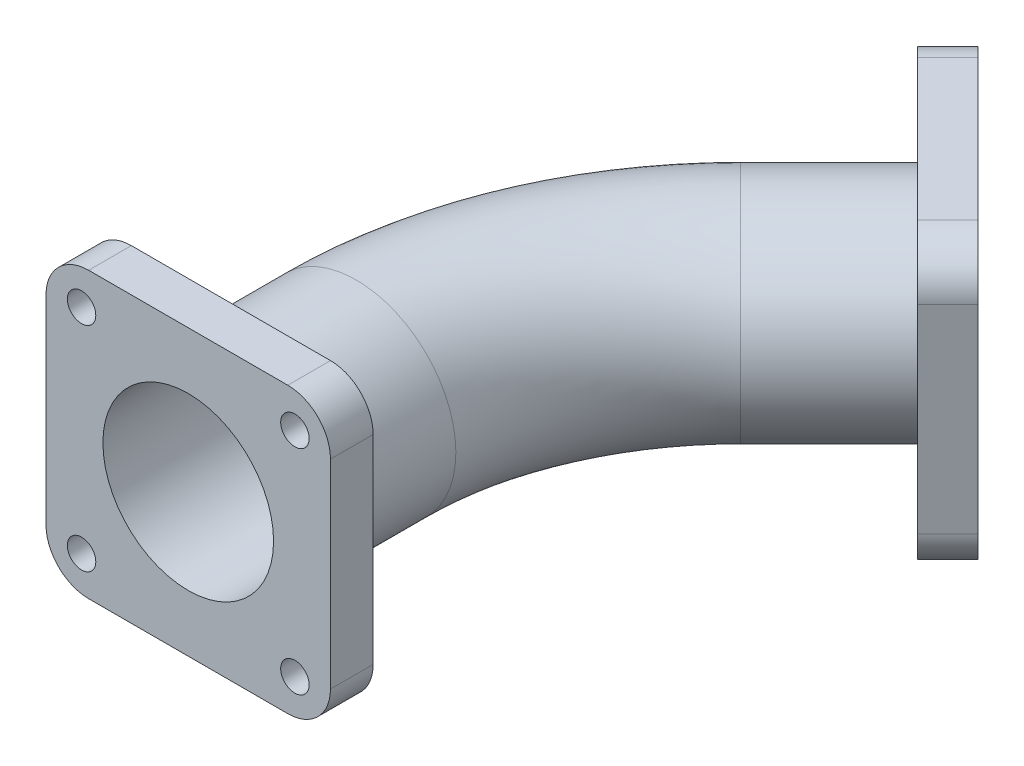
ISO-10303-21;
HEADER;
FILE_DESCRIPTION(('STEP AP214'),'2;1');
FILE_NAME('part.step','',(''),(''),'','','');
FILE_SCHEMA(('AUTOMOTIVE_DESIGN { 1 0 10303 214 1 1 1 1 }'));
ENDSEC;
DATA;
#1=APPLICATION_CONTEXT('core data for automotive mechanical design processes');
#2=APPLICATION_PROTOCOL_DEFINITION('international standard','automotive_design',2000,#1);
#3=PRODUCT_CONTEXT('',#1,'mechanical');
#4=PRODUCT('Part','Part','',(#3));
#5=PRODUCT_RELATED_PRODUCT_CATEGORY('part','',(#4));
#6=PRODUCT_DEFINITION_FORMATION('','',#4);
#7=PRODUCT_DEFINITION_CONTEXT('part definition',#1,'design');
#8=PRODUCT_DEFINITION('design','',#6,#7);
#9=PRODUCT_DEFINITION_SHAPE('','',#8);
#10=(LENGTH_UNIT() NAMED_UNIT(*) SI_UNIT(.MILLI.,.METRE.));
#11=(NAMED_UNIT(*) PLANE_ANGLE_UNIT() SI_UNIT($,.RADIAN.));
#12=(NAMED_UNIT(*) SI_UNIT($,.STERADIAN.) SOLID_ANGLE_UNIT());
#13=UNCERTAINTY_MEASURE_WITH_UNIT(LENGTH_MEASURE(1.E-05),#10,'distance_accuracy_value','');
#14=(GEOMETRIC_REPRESENTATION_CONTEXT(3) GLOBAL_UNCERTAINTY_ASSIGNED_CONTEXT((#13)) GLOBAL_UNIT_ASSIGNED_CONTEXT((#10,
#11,#12)) REPRESENTATION_CONTEXT('',''));
#15=CARTESIAN_POINT('',(0.,0.,0.));
#16=DIRECTION('',(0.,0.,1.));
#17=DIRECTION('',(1.,0.,0.));
#18=AXIS2_PLACEMENT_3D('',#15,#16,#17);
#19=CARTESIAN_POINT('',(0.,0.,0.));
#20=DIRECTION('',(0.,0.,-1.));
#21=DIRECTION('',(-1.,0.,0.));
#22=AXIS2_PLACEMENT_3D('',#19,#20,#21);
#23=PLANE('',#22);
#24=DIRECTION('',(-1.,0.,0.));
#25=VECTOR('',#24,1.);
#26=CARTESIAN_POINT('',(-50.,50.,0.));
#27=LINE('',#26,#25);
#28=CARTESIAN_POINT('',(35.,50.,0.));
#29=VERTEX_POINT('',#28);
#30=CARTESIAN_POINT('',(-35.,50.,0.));
#31=VERTEX_POINT('',#30);
#32=EDGE_CURVE('E173',#29,#31,#27,.T.);
#33=ORIENTED_EDGE('',*,*,#32,.F.);
#34=CARTESIAN_POINT('',(35.,35.,0.));
#35=DIRECTION('',(0.,0.,-1.));
#36=DIRECTION('',(-1.,0.,0.));
#37=AXIS2_PLACEMENT_3D('',#34,#35,#36);
#38=CIRCLE('',#37,15.);
#39=CARTESIAN_POINT('',(50.,35.,0.));
#40=VERTEX_POINT('',#39);
#41=EDGE_CURVE('E155',#29,#40,#38,.T.);
#42=ORIENTED_EDGE('',*,*,#41,.T.);
#43=DIRECTION('',(0.,1.,0.));
#44=VECTOR('',#43,1.);
#45=CARTESIAN_POINT('',(50.,-50.,0.));
#46=LINE('',#45,#44);
#47=CARTESIAN_POINT('',(50.,-35.,0.));
#48=VERTEX_POINT('',#47);
#49=EDGE_CURVE('E185',#48,#40,#46,.T.);
#50=ORIENTED_EDGE('',*,*,#49,.F.);
#51=CARTESIAN_POINT('',(35.,-35.,0.));
#52=DIRECTION('',(0.,0.,-1.));
#53=DIRECTION('',(-1.,0.,0.));
#54=AXIS2_PLACEMENT_3D('',#51,#52,#53);
#55=CIRCLE('',#54,15.);
#56=CARTESIAN_POINT('',(35.,-50.,0.));
#57=VERTEX_POINT('',#56);
#58=EDGE_CURVE('E178',#48,#57,#55,.T.);
#59=ORIENTED_EDGE('',*,*,#58,.T.);
#60=DIRECTION('',(1.,0.,0.));
#61=VECTOR('',#60,1.);
#62=CARTESIAN_POINT('',(-50.,-50.,0.));
#63=LINE('',#62,#61);
#64=CARTESIAN_POINT('',(-35.,-50.,0.));
#65=VERTEX_POINT('',#64);
#66=EDGE_CURVE('E190',#65,#57,#63,.T.);
#67=ORIENTED_EDGE('',*,*,#66,.F.);
#68=CARTESIAN_POINT('',(-35.,-35.,0.));
#69=DIRECTION('',(0.,0.,-1.));
#70=DIRECTION('',(-1.,0.,0.));
#71=AXIS2_PLACEMENT_3D('',#68,#69,#70);
#72=CIRCLE('',#71,15.);
#73=CARTESIAN_POINT('',(-50.,-35.,0.));
#74=VERTEX_POINT('',#73);
#75=EDGE_CURVE('E205',#65,#74,#72,.T.);
#76=ORIENTED_EDGE('',*,*,#75,.T.);
#77=DIRECTION('',(0.,-1.,0.));
#78=VECTOR('',#77,1.);
#79=CARTESIAN_POINT('',(-50.,-50.,0.));
#80=LINE('',#79,#78);
#81=CARTESIAN_POINT('',(-50.,35.,0.));
#82=VERTEX_POINT('',#81);
#83=EDGE_CURVE('E184',#82,#74,#80,.T.);
#84=ORIENTED_EDGE('',*,*,#83,.F.);
#85=CARTESIAN_POINT('',(-35.,35.,0.));
#86=DIRECTION('',(0.,0.,-1.));
#87=DIRECTION('',(-1.,0.,0.));
#88=AXIS2_PLACEMENT_3D('',#85,#86,#87);
#89=CIRCLE('',#88,15.);
#90=EDGE_CURVE('E167',#82,#31,#89,.T.);
#91=ORIENTED_EDGE('',*,*,#90,.T.);
#92=EDGE_LOOP('',(#33,#42,#50,#59,#67,#76,#84,#91));
#93=FACE_BOUND('',#92,.T.);
#94=CARTESIAN_POINT('',(-37.5,37.5,0.));
#95=DIRECTION('',(0.,0.,1.));
#96=DIRECTION('',(1.,0.,0.));
#97=AXIS2_PLACEMENT_3D('',#94,#95,#96);
#98=CIRCLE('',#97,5.);
#99=CARTESIAN_POINT('',(-32.5,37.5,0.));
#100=VERTEX_POINT('',#99);
#101=EDGE_CURVE('E350',#100,#100,#98,.T.);
#102=ORIENTED_EDGE('',*,*,#101,.T.);
#103=EDGE_LOOP('',(#102));
#104=FACE_BOUND('',#103,.T.);
#105=CARTESIAN_POINT('',(37.5,37.5,0.));
#106=DIRECTION('',(0.,0.,1.));
#107=DIRECTION('',(1.,0.,0.));
#108=AXIS2_PLACEMENT_3D('',#105,#106,#107);
#109=CIRCLE('',#108,5.);
#110=CARTESIAN_POINT('',(42.5,37.5,0.));
#111=VERTEX_POINT('',#110);
#112=EDGE_CURVE('E358',#111,#111,#109,.T.);
#113=ORIENTED_EDGE('',*,*,#112,.T.);
#114=EDGE_LOOP('',(#113));
#115=FACE_BOUND('',#114,.T.);
#116=CARTESIAN_POINT('',(37.5,-37.5,0.));
#117=DIRECTION('',(0.,0.,1.));
#118=DIRECTION('',(1.,0.,0.));
#119=AXIS2_PLACEMENT_3D('',#116,#117,#118);
#120=CIRCLE('',#119,5.);
#121=CARTESIAN_POINT('',(42.5,-37.5,0.));
#122=VERTEX_POINT('',#121);
#123=EDGE_CURVE('E366',#122,#122,#120,.T.);
#124=ORIENTED_EDGE('',*,*,#123,.T.);
#125=EDGE_LOOP('',(#124));
#126=FACE_BOUND('',#125,.T.);
#127=CARTESIAN_POINT('',(-37.5,-37.5,0.));
#128=DIRECTION('',(0.,0.,1.));
#129=DIRECTION('',(1.,0.,0.));
#130=AXIS2_PLACEMENT_3D('',#127,#128,#129);
#131=CIRCLE('',#130,5.);
#132=CARTESIAN_POINT('',(-32.5,-37.5,0.));
#133=VERTEX_POINT('',#132);
#134=EDGE_CURVE('E335',#133,#133,#131,.T.);
#135=ORIENTED_EDGE('',*,*,#134,.T.);
#136=EDGE_LOOP('',(#135));
#137=FACE_BOUND('',#136,.T.);
#138=CARTESIAN_POINT('',(0.,0.,0.));
#139=DIRECTION('',(0.,0.,1.));
#140=DIRECTION('',(1.,0.,0.));
#141=AXIS2_PLACEMENT_3D('',#138,#139,#140);
#142=CIRCLE('',#141,35.);
#143=CARTESIAN_POINT('',(35.,0.,0.));
#144=VERTEX_POINT('',#143);
#145=EDGE_CURVE('E331',#144,#144,#142,.T.);
#146=ORIENTED_EDGE('',*,*,#145,.T.);
#147=EDGE_LOOP('',(#146));
#148=FACE_BOUND('',#147,.T.);
#149=ADVANCED_FACE('F39',(#93,#104,#115,#126,#137,#148),#23,.T.);
#150=CARTESIAN_POINT('',(50.,-50.,15.));
#151=DIRECTION('',(-1.,0.,0.));
#152=DIRECTION('',(0.,0.,1.));
#153=AXIS2_PLACEMENT_3D('',#150,#151,#152);
#154=PLANE('',#153);
#155=ORIENTED_EDGE('',*,*,#49,.T.);
#156=DIRECTION('',(0.,0.,-1.));
#157=VECTOR('',#156,1.);
#158=CARTESIAN_POINT('',(50.,35.,15.));
#159=LINE('',#158,#157);
#160=CARTESIAN_POINT('',(50.,35.,15.));
#161=VERTEX_POINT('',#160);
#162=EDGE_CURVE('E160',#40,#161,#159,.F.);
#163=ORIENTED_EDGE('',*,*,#162,.T.);
#164=DIRECTION('',(0.,1.,0.));
#165=VECTOR('',#164,1.);
#166=CARTESIAN_POINT('',(50.,-50.,15.));
#167=LINE('',#166,#165);
#168=CARTESIAN_POINT('',(50.,-35.,15.));
#169=VERTEX_POINT('',#168);
#170=EDGE_CURVE('E199',#169,#161,#167,.T.);
#171=ORIENTED_EDGE('',*,*,#170,.F.);
#172=DIRECTION('',(0.,0.,-1.));
#173=VECTOR('',#172,1.);
#174=CARTESIAN_POINT('',(50.,-35.,15.));
#175=LINE('',#174,#173);
#176=EDGE_CURVE('E166',#169,#48,#175,.T.);
#177=ORIENTED_EDGE('',*,*,#176,.T.);
#178=EDGE_LOOP('',(#155,#163,#171,#177));
#179=FACE_BOUND('',#178,.T.);
#180=ADVANCED_FACE('F403',(#179),#154,.F.);
#181=CARTESIAN_POINT('',(-50.,50.,15.));
#182=DIRECTION('',(0.,-1.,0.));
#183=DIRECTION('',(0.,0.,-1.));
#184=AXIS2_PLACEMENT_3D('',#181,#182,#183);
#185=PLANE('',#184);
#186=DIRECTION('',(-1.,0.,0.));
#187=VECTOR('',#186,1.);
#188=CARTESIAN_POINT('',(-50.,50.,15.));
#189=LINE('',#188,#187);
#190=CARTESIAN_POINT('',(35.,50.,15.));
#191=VERTEX_POINT('',#190);
#192=CARTESIAN_POINT('',(-35.,50.,15.));
#193=VERTEX_POINT('',#192);
#194=EDGE_CURVE('E176',#191,#193,#189,.T.);
#195=ORIENTED_EDGE('',*,*,#194,.F.);
#196=DIRECTION('',(0.,0.,-1.));
#197=VECTOR('',#196,1.);
#198=CARTESIAN_POINT('',(35.,50.,15.));
#199=LINE('',#198,#197);
#200=EDGE_CURVE('E159',#191,#29,#199,.T.);
#201=ORIENTED_EDGE('',*,*,#200,.T.);
#202=ORIENTED_EDGE('',*,*,#32,.T.);
#203=DIRECTION('',(0.,0.,-1.));
#204=VECTOR('',#203,1.);
#205=CARTESIAN_POINT('',(-35.,50.,15.));
#206=LINE('',#205,#204);
#207=EDGE_CURVE('E179',#31,#193,#206,.F.);
#208=ORIENTED_EDGE('',*,*,#207,.T.);
#209=EDGE_LOOP('',(#195,#201,#202,#208));
#210=FACE_BOUND('',#209,.T.);
#211=ADVANCED_FACE('F172',(#210),#185,.F.);
#212=CARTESIAN_POINT('',(-50.,-50.,15.));
#213=DIRECTION('',(1.,0.,0.));
#214=DIRECTION('',(0.,0.,-1.));
#215=AXIS2_PLACEMENT_3D('',#212,#213,#214);
#216=PLANE('',#215);
#217=DIRECTION('',(0.,-1.,0.));
#218=VECTOR('',#217,1.);
#219=CARTESIAN_POINT('',(-50.,-50.,15.));
#220=LINE('',#219,#218);
#221=CARTESIAN_POINT('',(-50.,35.,15.));
#222=VERTEX_POINT('',#221);
#223=CARTESIAN_POINT('',(-50.,-35.,15.));
#224=VERTEX_POINT('',#223);
#225=EDGE_CURVE('E385',#222,#224,#220,.T.);
#226=ORIENTED_EDGE('',*,*,#225,.F.);
#227=DIRECTION('',(0.,0.,-1.));
#228=VECTOR('',#227,1.);
#229=CARTESIAN_POINT('',(-50.,35.,15.));
#230=LINE('',#229,#228);
#231=EDGE_CURVE('E230',#222,#82,#230,.T.);
#232=ORIENTED_EDGE('',*,*,#231,.T.);
#233=ORIENTED_EDGE('',*,*,#83,.T.);
#234=DIRECTION('',(0.,0.,-1.));
#235=VECTOR('',#234,1.);
#236=CARTESIAN_POINT('',(-50.,-35.,15.));
#237=LINE('',#236,#235);
#238=EDGE_CURVE('E227',#74,#224,#237,.F.);
#239=ORIENTED_EDGE('',*,*,#238,.T.);
#240=EDGE_LOOP('',(#226,#232,#233,#239));
#241=FACE_BOUND('',#240,.T.);
#242=ADVANCED_FACE('F411',(#241),#216,.F.);
#243=CARTESIAN_POINT('',(-50.,-50.,15.));
#244=DIRECTION('',(0.,1.,0.));
#245=DIRECTION('',(0.,0.,1.));
#246=AXIS2_PLACEMENT_3D('',#243,#244,#245);
#247=PLANE('',#246);
#248=DIRECTION('',(1.,0.,0.));
#249=VECTOR('',#248,1.);
#250=CARTESIAN_POINT('',(-50.,-50.,15.));
#251=LINE('',#250,#249);
#252=CARTESIAN_POINT('',(-35.,-50.,15.));
#253=VERTEX_POINT('',#252);
#254=CARTESIAN_POINT('',(35.,-50.,15.));
#255=VERTEX_POINT('',#254);
#256=EDGE_CURVE('E201',#253,#255,#251,.T.);
#257=ORIENTED_EDGE('',*,*,#256,.F.);
#258=DIRECTION('',(0.,0.,-1.));
#259=VECTOR('',#258,1.);
#260=CARTESIAN_POINT('',(-35.,-50.,15.));
#261=LINE('',#260,#259);
#262=EDGE_CURVE('E237',#253,#65,#261,.T.);
#263=ORIENTED_EDGE('',*,*,#262,.T.);
#264=ORIENTED_EDGE('',*,*,#66,.T.);
#265=DIRECTION('',(0.,0.,-1.));
#266=VECTOR('',#265,1.);
#267=CARTESIAN_POINT('',(35.,-50.,15.));
#268=LINE('',#267,#266);
#269=EDGE_CURVE('E234',#57,#255,#268,.F.);
#270=ORIENTED_EDGE('',*,*,#269,.T.);
#271=EDGE_LOOP('',(#257,#263,#264,#270));
#272=FACE_BOUND('',#271,.T.);
#273=ADVANCED_FACE('F405',(#272),#247,.F.);
#274=CARTESIAN_POINT('',(0.,0.,15.));
#275=DIRECTION('',(0.,0.,-1.));
#276=DIRECTION('',(-1.,0.,0.));
#277=AXIS2_PLACEMENT_3D('',#274,#275,#276);
#278=PLANE('',#277);
#279=CARTESIAN_POINT('',(-37.5,-37.5,15.));
#280=DIRECTION('',(0.,0.,1.));
#281=DIRECTION('',(1.,0.,0.));
#282=AXIS2_PLACEMENT_3D('',#279,#280,#281);
#283=CIRCLE('',#282,5.);
#284=CARTESIAN_POINT('',(-32.5,-37.5,15.));
#285=VERTEX_POINT('',#284);
#286=EDGE_CURVE('E370',#285,#285,#283,.T.);
#287=ORIENTED_EDGE('',*,*,#286,.F.);
#288=EDGE_LOOP('',(#287));
#289=FACE_BOUND('',#288,.T.);
#290=CARTESIAN_POINT('',(37.5,-37.5,15.));
#291=DIRECTION('',(0.,0.,1.));
#292=DIRECTION('',(1.,0.,0.));
#293=AXIS2_PLACEMENT_3D('',#290,#291,#292);
#294=CIRCLE('',#293,5.);
#295=CARTESIAN_POINT('',(42.5,-37.5,15.));
#296=VERTEX_POINT('',#295);
#297=EDGE_CURVE('E362',#296,#296,#294,.T.);
#298=ORIENTED_EDGE('',*,*,#297,.F.);
#299=EDGE_LOOP('',(#298));
#300=FACE_BOUND('',#299,.T.);
#301=CARTESIAN_POINT('',(37.5,37.5,15.));
#302=DIRECTION('',(0.,0.,1.));
#303=DIRECTION('',(1.,0.,0.));
#304=AXIS2_PLACEMENT_3D('',#301,#302,#303);
#305=CIRCLE('',#304,5.);
#306=CARTESIAN_POINT('',(42.5,37.5,15.));
#307=VERTEX_POINT('',#306);
#308=EDGE_CURVE('E354',#307,#307,#305,.T.);
#309=ORIENTED_EDGE('',*,*,#308,.F.);
#310=EDGE_LOOP('',(#309));
#311=FACE_BOUND('',#310,.T.);
#312=CARTESIAN_POINT('',(-37.5,37.5,15.));
#313=DIRECTION('',(0.,0.,1.));
#314=DIRECTION('',(1.,0.,0.));
#315=AXIS2_PLACEMENT_3D('',#312,#313,#314);
#316=CIRCLE('',#315,5.);
#317=CARTESIAN_POINT('',(-32.5,37.5,15.));
#318=VERTEX_POINT('',#317);
#319=EDGE_CURVE('E346',#318,#318,#316,.T.);
#320=ORIENTED_EDGE('',*,*,#319,.F.);
#321=EDGE_LOOP('',(#320));
#322=FACE_BOUND('',#321,.T.);
#323=CARTESIAN_POINT('',(0.,0.,15.));
#324=DIRECTION('',(0.,0.,1.));
#325=DIRECTION('',(1.,0.,0.));
#326=AXIS2_PLACEMENT_3D('',#323,#324,#325);
#327=CIRCLE('',#326,30.);
#328=CARTESIAN_POINT('',(30.,0.,15.));
#329=VERTEX_POINT('',#328);
#330=EDGE_CURVE('E192',#329,#329,#327,.T.);
#331=ORIENTED_EDGE('',*,*,#330,.F.);
#332=EDGE_LOOP('',(#331));
#333=FACE_BOUND('',#332,.T.);
#334=ORIENTED_EDGE('',*,*,#170,.T.);
#335=CARTESIAN_POINT('',(35.,35.,15.));
#336=DIRECTION('',(0.,0.,-1.));
#337=DIRECTION('',(-1.,0.,0.));
#338=AXIS2_PLACEMENT_3D('',#335,#336,#337);
#339=CIRCLE('',#338,15.);
#340=EDGE_CURVE('E224',#161,#191,#339,.F.);
#341=ORIENTED_EDGE('',*,*,#340,.T.);
#342=ORIENTED_EDGE('',*,*,#194,.T.);
#343=CARTESIAN_POINT('',(-35.,35.,15.));
#344=DIRECTION('',(0.,0.,-1.));
#345=DIRECTION('',(-1.,0.,0.));
#346=AXIS2_PLACEMENT_3D('',#343,#344,#345);
#347=CIRCLE('',#346,15.);
#348=EDGE_CURVE('E221',#193,#222,#347,.F.);
#349=ORIENTED_EDGE('',*,*,#348,.T.);
#350=ORIENTED_EDGE('',*,*,#225,.T.);
#351=CARTESIAN_POINT('',(-35.,-35.,15.));
#352=DIRECTION('',(0.,0.,-1.));
#353=DIRECTION('',(-1.,0.,0.));
#354=AXIS2_PLACEMENT_3D('',#351,#352,#353);
#355=CIRCLE('',#354,15.);
#356=EDGE_CURVE('E218',#224,#253,#355,.F.);
#357=ORIENTED_EDGE('',*,*,#356,.T.);
#358=ORIENTED_EDGE('',*,*,#256,.T.);
#359=CARTESIAN_POINT('',(35.,-35.,15.));
#360=DIRECTION('',(0.,0.,-1.));
#361=DIRECTION('',(-1.,0.,0.));
#362=AXIS2_PLACEMENT_3D('',#359,#360,#361);
#363=CIRCLE('',#362,15.);
#364=EDGE_CURVE('E215',#255,#169,#363,.F.);
#365=ORIENTED_EDGE('',*,*,#364,.T.);
#366=EDGE_LOOP('',(#334,#341,#342,#349,#350,#357,#358,#365));
#367=FACE_BOUND('',#366,.T.);
#368=ADVANCED_FACE('F393',(#289,#300,#311,#322,#333,#367),#278,.F.);
#369=CARTESIAN_POINT('',(0.,0.,15.));
#370=DIRECTION('',(0.,0.,-1.));
#371=DIRECTION('',(-1.,0.,0.));
#372=AXIS2_PLACEMENT_3D('',#369,#370,#371);
#373=CYLINDRICAL_SURFACE('',#372,30.);
#374=ORIENTED_EDGE('',*,*,#330,.T.);
#375=EDGE_LOOP('',(#374));
#376=FACE_BOUND('',#375,.T.);
#377=CARTESIAN_POINT('',(0.,0.,-44.0811690796315));
#378=DIRECTION('',(0.,0.,1.));
#379=DIRECTION('',(1.,0.,0.));
#380=AXIS2_PLACEMENT_3D('',#377,#378,#379);
#381=CIRCLE('',#380,30.);
#382=CARTESIAN_POINT('',(-30.,0.,-44.0811690796313));
#383=VERTEX_POINT('',#382);
#384=EDGE_CURVE('E326',#383,#383,#381,.F.);
#385=ORIENTED_EDGE('',*,*,#384,.T.);
#386=EDGE_LOOP('',(#385));
#387=FACE_BOUND('',#386,.T.);
#388=ADVANCED_FACE('F457',(#376,#387),#373,.F.);
#389=CARTESIAN_POINT('',(-37.5,37.5,15.));
#390=DIRECTION('',(0.,0.,-1.));
#391=DIRECTION('',(-1.,0.,0.));
#392=AXIS2_PLACEMENT_3D('',#389,#390,#391);
#393=CYLINDRICAL_SURFACE('',#392,5.);
#394=ORIENTED_EDGE('',*,*,#319,.T.);
#395=EDGE_LOOP('',(#394));
#396=FACE_BOUND('',#395,.T.);
#397=ORIENTED_EDGE('',*,*,#101,.F.);
#398=EDGE_LOOP('',(#397));
#399=FACE_BOUND('',#398,.T.);
#400=ADVANCED_FACE('F465',(#396,#399),#393,.F.);
#401=CARTESIAN_POINT('',(37.5,37.5,15.));
#402=DIRECTION('',(0.,0.,-1.));
#403=DIRECTION('',(-1.,0.,0.));
#404=AXIS2_PLACEMENT_3D('',#401,#402,#403);
#405=CYLINDRICAL_SURFACE('',#404,5.);
#406=ORIENTED_EDGE('',*,*,#308,.T.);
#407=EDGE_LOOP('',(#406));
#408=FACE_BOUND('',#407,.T.);
#409=ORIENTED_EDGE('',*,*,#112,.F.);
#410=EDGE_LOOP('',(#409));
#411=FACE_BOUND('',#410,.T.);
#412=ADVANCED_FACE('F474',(#408,#411),#405,.F.);
#413=CARTESIAN_POINT('',(37.5,-37.5,15.));
#414=DIRECTION('',(0.,0.,-1.));
#415=DIRECTION('',(-1.,0.,0.));
#416=AXIS2_PLACEMENT_3D('',#413,#414,#415);
#417=CYLINDRICAL_SURFACE('',#416,5.);
#418=ORIENTED_EDGE('',*,*,#297,.T.);
#419=EDGE_LOOP('',(#418));
#420=FACE_BOUND('',#419,.T.);
#421=ORIENTED_EDGE('',*,*,#123,.F.);
#422=EDGE_LOOP('',(#421));
#423=FACE_BOUND('',#422,.T.);
#424=ADVANCED_FACE('F482',(#420,#423),#417,.F.);
#425=CARTESIAN_POINT('',(-37.5,-37.5,15.));
#426=DIRECTION('',(0.,0.,-1.));
#427=DIRECTION('',(-1.,0.,0.));
#428=AXIS2_PLACEMENT_3D('',#425,#426,#427);
#429=CYLINDRICAL_SURFACE('',#428,5.);
#430=ORIENTED_EDGE('',*,*,#286,.T.);
#431=EDGE_LOOP('',(#430));
#432=FACE_BOUND('',#431,.T.);
#433=ORIENTED_EDGE('',*,*,#134,.F.);
#434=EDGE_LOOP('',(#433));
#435=FACE_BOUND('',#434,.T.);
#436=ADVANCED_FACE('F490',(#432,#435),#429,.F.);
#437=CARTESIAN_POINT('',(0.,0.,0.));
#438=DIRECTION('',(0.,0.,-1.));
#439=DIRECTION('',(-1.,0.,0.));
#440=AXIS2_PLACEMENT_3D('',#437,#438,#439);
#441=CYLINDRICAL_SURFACE('',#440,35.);
#442=CARTESIAN_POINT('',(0.,0.,-44.0811690796315));
#443=DIRECTION('',(0.,0.,1.));
#444=DIRECTION('',(1.,0.,0.));
#445=AXIS2_PLACEMENT_3D('',#442,#443,#444);
#446=CIRCLE('',#445,35.);
#447=CARTESIAN_POINT('',(-35.,0.,-44.0811690796313));
#448=VERTEX_POINT('',#447);
#449=EDGE_CURVE('E325',#448,#448,#446,.T.);
#450=ORIENTED_EDGE('',*,*,#449,.T.);
#451=EDGE_LOOP('',(#450));
#452=FACE_BOUND('',#451,.T.);
#453=ORIENTED_EDGE('',*,*,#145,.F.);
#454=EDGE_LOOP('',(#453));
#455=FACE_BOUND('',#454,.T.);
#456=ADVANCED_FACE('F497',(#452,#455),#441,.T.);
#457=CARTESIAN_POINT('',(135.,0.,-44.081169079632));
#458=DIRECTION('',(0.,-1.,0.));
#459=DIRECTION('',(0.,0.,-1.));
#460=AXIS2_PLACEMENT_3D('',#457,#458,#459);
#461=TOROIDAL_SURFACE('',#460,135.,35.);
#462=CARTESIAN_POINT('',(39.5405845398167,0.,-139.540584539816));
#463=DIRECTION('',(-0.707106781186552,0.,0.707106781186543));
#464=DIRECTION('',(0.707106781186543,0.,0.707106781186552));
#465=AXIS2_PLACEMENT_3D('',#462,#463,#464);
#466=CIRCLE('',#465,35.);
#467=CARTESIAN_POINT('',(14.7918471982876,0.,-164.289321881346));
#468=VERTEX_POINT('',#467);
#469=EDGE_CURVE('E339',#468,#468,#466,.T.);
#470=CARTESIAN_POINT('',(135.,0.,-44.081169079632));
#471=DIRECTION('',(0.,-1.,0.));
#472=DIRECTION('',(0.,0.,-1.));
#473=AXIS2_PLACEMENT_3D('',#470,#471,#472);
#474=CIRCLE('',#473,170.);
#475=EDGE_CURVE('',#448,#468,#474,.T.);
#476=ORIENTED_EDGE('',*,*,#449,.F.);
#477=ORIENTED_EDGE('',*,*,#469,.T.);
#478=ORIENTED_EDGE('',*,*,#475,.T.);
#479=ORIENTED_EDGE('',*,*,#475,.F.);
#480=EDGE_LOOP('',(#476,#478,#477,#479));
#481=FACE_BOUND('',#480,.T.);
#482=ADVANCED_FACE('F505',(#481),#461,.T.);
#483=CARTESIAN_POINT('',(39.5405845398167,0.,-139.540584539817));
#484=DIRECTION('',(0.707106781186549,0.,-0.707106781186546));
#485=DIRECTION('',(-0.707106781186546,0.,-0.707106781186549));
#486=AXIS2_PLACEMENT_3D('',#483,#484,#485);
#487=CYLINDRICAL_SURFACE('',#486,35.);
#488=CARTESIAN_POINT('',(70.7106781186549,0.,-170.710678118655));
#489=DIRECTION('',(0.707106781186549,0.,-0.707106781186546));
#490=DIRECTION('',(-0.707106781186546,0.,-0.707106781186549));
#491=AXIS2_PLACEMENT_3D('',#488,#489,#490);
#492=CIRCLE('',#491,35.);
#493=CARTESIAN_POINT('',(45.9619407771258,0.,-195.459415460184));
#494=VERTEX_POINT('',#493);
#495=EDGE_CURVE('E321',#494,#494,#492,.T.);
#496=ORIENTED_EDGE('',*,*,#495,.F.);
#497=EDGE_LOOP('',(#496));
#498=FACE_BOUND('',#497,.T.);
#499=ORIENTED_EDGE('',*,*,#469,.F.);
#500=EDGE_LOOP('',(#499));
#501=FACE_BOUND('',#500,.T.);
#502=ADVANCED_FACE('F513',(#498,#501),#487,.T.);
#503=CARTESIAN_POINT('',(135.,0.,-44.081169079632));
#504=DIRECTION('',(0.,-1.,0.));
#505=DIRECTION('',(0.,0.,-1.));
#506=AXIS2_PLACEMENT_3D('',#503,#504,#505);
#507=TOROIDAL_SURFACE('',#506,135.,30.);
#508=CARTESIAN_POINT('',(39.5405845398167,0.,-139.540584539816));
#509=DIRECTION('',(-0.707106781186552,0.,0.707106781186543));
#510=DIRECTION('',(0.707106781186543,0.,0.707106781186552));
#511=AXIS2_PLACEMENT_3D('',#508,#509,#510);
#512=CIRCLE('',#511,30.);
#513=CARTESIAN_POINT('',(18.3273811042203,0.,-160.753787975413));
#514=VERTEX_POINT('',#513);
#515=EDGE_CURVE('E330',#514,#514,#512,.F.);
#516=CARTESIAN_POINT('',(135.,0.,-44.081169079632));
#517=DIRECTION('',(0.,-1.,0.));
#518=DIRECTION('',(0.,0.,-1.));
#519=AXIS2_PLACEMENT_3D('',#516,#517,#518);
#520=CIRCLE('',#519,165.);
#521=EDGE_CURVE('',#383,#514,#520,.T.);
#522=ORIENTED_EDGE('',*,*,#384,.F.);
#523=ORIENTED_EDGE('',*,*,#515,.T.);
#524=ORIENTED_EDGE('',*,*,#521,.T.);
#525=ORIENTED_EDGE('',*,*,#521,.F.);
#526=EDGE_LOOP('',(#522,#524,#523,#525));
#527=FACE_BOUND('',#526,.T.);
#528=ADVANCED_FACE('F522',(#527),#507,.F.);
#529=CARTESIAN_POINT('',(39.5405845398167,0.,-139.540584539817));
#530=DIRECTION('',(0.707106781186549,0.,-0.707106781186546));
#531=DIRECTION('',(-0.707106781186546,0.,-0.707106781186549));
#532=AXIS2_PLACEMENT_3D('',#529,#530,#531);
#533=CYLINDRICAL_SURFACE('',#532,30.);
#534=ORIENTED_EDGE('',*,*,#515,.F.);
#535=EDGE_LOOP('',(#534));
#536=FACE_BOUND('',#535,.T.);
#537=CARTESIAN_POINT('',(81.3172798364531,0.,-181.317279836453));
#538=DIRECTION('',(0.707106781186549,0.,-0.707106781186546));
#539=DIRECTION('',(-0.707106781186546,0.,-0.707106781186549));
#540=AXIS2_PLACEMENT_3D('',#537,#538,#539);
#541=CIRCLE('',#540,30.);
#542=CARTESIAN_POINT('',(60.1040764008567,0.,-202.530483272049));
#543=VERTEX_POINT('',#542);
#544=EDGE_CURVE('E679',#543,#543,#541,.T.);
#545=ORIENTED_EDGE('',*,*,#544,.T.);
#546=EDGE_LOOP('',(#545));
#547=FACE_BOUND('',#546,.T.);
#548=ADVANCED_FACE('F500',(#536,#547),#533,.F.);
#549=CARTESIAN_POINT('',(120.710678118655,0.,-120.710678118654));
#550=DIRECTION('',(0.707106781186549,0.,-0.707106781186546));
#551=DIRECTION('',(-0.707106781186546,0.,-0.707106781186549));
#552=AXIS2_PLACEMENT_3D('',#549,#550,#551);
#553=PLANE('',#552);
#554=CARTESIAN_POINT('',(97.2271824131504,37.5,-144.194173824159));
#555=DIRECTION('',(0.707106781186549,0.,-0.707106781186546));
#556=DIRECTION('',(-0.707106781186546,0.,-0.707106781186549));
#557=AXIS2_PLACEMENT_3D('',#554,#555,#556);
#558=CIRCLE('',#557,4.99999999999999);
#559=CARTESIAN_POINT('',(93.6916485072177,37.5,-147.729707730092));
#560=VERTEX_POINT('',#559);
#561=EDGE_CURVE('E690',#560,#560,#558,.T.);
#562=ORIENTED_EDGE('',*,*,#561,.T.);
#563=EDGE_LOOP('',(#562));
#564=FACE_BOUND('',#563,.T.);
#565=CARTESIAN_POINT('',(97.2271824131504,-37.5,-144.194173824159));
#566=DIRECTION('',(0.707106781186549,0.,-0.707106781186546));
#567=DIRECTION('',(-0.707106781186546,0.,-0.707106781186549));
#568=AXIS2_PLACEMENT_3D('',#565,#566,#567);
#569=CIRCLE('',#568,5.);
#570=CARTESIAN_POINT('',(93.6916485072176,-37.5,-147.729707730092));
#571=VERTEX_POINT('',#570);
#572=EDGE_CURVE('E698',#571,#571,#569,.T.);
#573=ORIENTED_EDGE('',*,*,#572,.T.);
#574=EDGE_LOOP('',(#573));
#575=FACE_BOUND('',#574,.T.);
#576=CARTESIAN_POINT('',(44.1941738241594,-37.5,-197.22718241315));
#577=DIRECTION('',(0.707106781186549,0.,-0.707106781186546));
#578=DIRECTION('',(-0.707106781186546,0.,-0.707106781186549));
#579=AXIS2_PLACEMENT_3D('',#576,#577,#578);
#580=CIRCLE('',#579,5.00000000000001);
#581=CARTESIAN_POINT('',(40.6586399182267,-37.5,-200.762716319083));
#582=VERTEX_POINT('',#581);
#583=EDGE_CURVE('E706',#582,#582,#580,.T.);
#584=ORIENTED_EDGE('',*,*,#583,.T.);
#585=EDGE_LOOP('',(#584));
#586=FACE_BOUND('',#585,.T.);
#587=CARTESIAN_POINT('',(44.1941738241594,37.5,-197.22718241315));
#588=DIRECTION('',(0.707106781186549,0.,-0.707106781186546));
#589=DIRECTION('',(-0.707106781186546,0.,-0.707106781186549));
#590=AXIS2_PLACEMENT_3D('',#587,#588,#589);
#591=CIRCLE('',#590,5.00000000000001);
#592=CARTESIAN_POINT('',(40.6586399182267,37.5,-200.762716319083));
#593=VERTEX_POINT('',#592);
#594=EDGE_CURVE('E714',#593,#593,#591,.T.);
#595=ORIENTED_EDGE('',*,*,#594,.T.);
#596=EDGE_LOOP('',(#595));
#597=FACE_BOUND('',#596,.T.);
#598=DIRECTION('',(0.707106781186546,0.,0.707106781186549));
#599=VECTOR('',#598,1.);
#600=CARTESIAN_POINT('',(106.066017177982,50.,-135.355339059327));
#601=LINE('',#600,#599);
#602=CARTESIAN_POINT('',(45.9619407771258,50.,-195.459415460184));
#603=VERTEX_POINT('',#602);
#604=CARTESIAN_POINT('',(95.459415460184,50.,-145.961940777125));
#605=VERTEX_POINT('',#604);
#606=EDGE_CURVE('E317',#603,#605,#601,.T.);
#607=ORIENTED_EDGE('',*,*,#606,.F.);
#608=CARTESIAN_POINT('',(45.9619407771258,35.,-195.459415460184));
#609=DIRECTION('',(0.707106781186549,0.,-0.707106781186546));
#610=DIRECTION('',(-0.707106781186546,0.,-0.707106781186549));
#611=AXIS2_PLACEMENT_3D('',#608,#609,#610);
#612=CIRCLE('',#611,15.);
#613=CARTESIAN_POINT('',(35.3553390593276,35.,-206.066017177982));
#614=VERTEX_POINT('',#613);
#615=EDGE_CURVE('E257',#603,#614,#612,.F.);
#616=ORIENTED_EDGE('',*,*,#615,.T.);
#617=DIRECTION('',(0.,1.,0.));
#618=VECTOR('',#617,1.);
#619=CARTESIAN_POINT('',(35.3553390593276,50.,-206.066017177982));
#620=LINE('',#619,#618);
#621=CARTESIAN_POINT('',(35.3553390593276,-35.,-206.066017177982));
#622=VERTEX_POINT('',#621);
#623=EDGE_CURVE('E676',#622,#614,#620,.T.);
#624=ORIENTED_EDGE('',*,*,#623,.F.);
#625=CARTESIAN_POINT('',(45.9619407771258,-35.,-195.459415460184));
#626=DIRECTION('',(0.707106781186549,0.,-0.707106781186546));
#627=DIRECTION('',(-0.707106781186546,0.,-0.707106781186549));
#628=AXIS2_PLACEMENT_3D('',#625,#626,#627);
#629=CIRCLE('',#628,15.);
#630=CARTESIAN_POINT('',(45.9619407771258,-50.,-195.459415460184));
#631=VERTEX_POINT('',#630);
#632=EDGE_CURVE('E254',#622,#631,#629,.F.);
#633=ORIENTED_EDGE('',*,*,#632,.T.);
#634=DIRECTION('',(-0.707106781186546,0.,-0.707106781186549));
#635=VECTOR('',#634,1.);
#636=CARTESIAN_POINT('',(106.066017177982,-50.,-135.355339059327));
#637=LINE('',#636,#635);
#638=CARTESIAN_POINT('',(95.459415460184,-50.,-145.961940777125));
#639=VERTEX_POINT('',#638);
#640=EDGE_CURVE('E305',#639,#631,#637,.T.);
#641=ORIENTED_EDGE('',*,*,#640,.F.);
#642=CARTESIAN_POINT('',(95.459415460184,-35.,-145.961940777125));
#643=DIRECTION('',(0.707106781186549,0.,-0.707106781186546));
#644=DIRECTION('',(-0.707106781186546,0.,-0.707106781186549));
#645=AXIS2_PLACEMENT_3D('',#642,#643,#644);
#646=CIRCLE('',#645,15.);
#647=CARTESIAN_POINT('',(106.066017177982,-35.,-135.355339059327));
#648=VERTEX_POINT('',#647);
#649=EDGE_CURVE('E248',#639,#648,#646,.F.);
#650=ORIENTED_EDGE('',*,*,#649,.T.);
#651=DIRECTION('',(0.,-1.,0.));
#652=VECTOR('',#651,1.);
#653=CARTESIAN_POINT('',(106.066017177982,50.,-135.355339059327));
#654=LINE('',#653,#652);
#655=CARTESIAN_POINT('',(106.066017177982,35.,-135.355339059327));
#656=VERTEX_POINT('',#655);
#657=EDGE_CURVE('E292',#656,#648,#654,.T.);
#658=ORIENTED_EDGE('',*,*,#657,.F.);
#659=CARTESIAN_POINT('',(95.459415460184,35.,-145.961940777125));
#660=DIRECTION('',(0.707106781186549,0.,-0.707106781186546));
#661=DIRECTION('',(-0.707106781186546,0.,-0.707106781186549));
#662=AXIS2_PLACEMENT_3D('',#659,#660,#661);
#663=CIRCLE('',#662,15.);
#664=EDGE_CURVE('E251',#656,#605,#663,.F.);
#665=ORIENTED_EDGE('',*,*,#664,.T.);
#666=EDGE_LOOP('',(#607,#616,#624,#633,#641,#650,#658,#665));
#667=FACE_BOUND('',#666,.T.);
#668=ORIENTED_EDGE('',*,*,#495,.T.);
#669=EDGE_LOOP('',(#668));
#670=FACE_BOUND('',#669,.T.);
#671=ADVANCED_FACE('F308',(#564,#575,#586,#597,#667,#670),#553,.F.);
#672=CARTESIAN_POINT('',(45.9619407771258,50.,-216.67261889578));
#673=DIRECTION('',(0.707106781186546,0.,0.707106781186549));
#674=DIRECTION('',(0.707106781186549,0.,-0.707106781186546));
#675=AXIS2_PLACEMENT_3D('',#672,#673,#674);
#676=PLANE('',#675);
#677=ORIENTED_EDGE('',*,*,#623,.T.);
#678=DIRECTION('',(-0.707106781186549,0.,0.707106781186546));
#679=VECTOR('',#678,1.);
#680=CARTESIAN_POINT('',(45.9619407771258,35.,-216.67261889578));
#681=LINE('',#680,#679);
#682=CARTESIAN_POINT('',(45.9619407771258,35.,-216.67261889578));
#683=VERTEX_POINT('',#682);
#684=EDGE_CURVE('E264',#614,#683,#681,.F.);
#685=ORIENTED_EDGE('',*,*,#684,.T.);
#686=DIRECTION('',(0.,1.,0.));
#687=VECTOR('',#686,1.);
#688=CARTESIAN_POINT('',(45.9619407771258,50.,-216.67261889578));
#689=LINE('',#688,#687);
#690=CARTESIAN_POINT('',(45.9619407771258,-35.,-216.67261889578));
#691=VERTEX_POINT('',#690);
#692=EDGE_CURVE('E312',#691,#683,#689,.T.);
#693=ORIENTED_EDGE('',*,*,#692,.F.);
#694=DIRECTION('',(-0.707106781186549,0.,0.707106781186546));
#695=VECTOR('',#694,1.);
#696=CARTESIAN_POINT('',(45.9619407771258,-35.,-216.67261889578));
#697=LINE('',#696,#695);
#698=EDGE_CURVE('E260',#691,#622,#697,.T.);
#699=ORIENTED_EDGE('',*,*,#698,.T.);
#700=EDGE_LOOP('',(#677,#685,#693,#699));
#701=FACE_BOUND('',#700,.T.);
#702=ADVANCED_FACE('F543',(#701),#676,.F.);
#703=CARTESIAN_POINT('',(116.67261889578,50.,-145.961940777125));
#704=DIRECTION('',(0.,-1.,0.));
#705=DIRECTION('',(1.,0.,0.));
#706=AXIS2_PLACEMENT_3D('',#703,#704,#705);
#707=PLANE('',#706);
#708=DIRECTION('',(0.707106781186546,0.,0.707106781186549));
#709=VECTOR('',#708,1.);
#710=CARTESIAN_POINT('',(116.67261889578,50.,-145.961940777125));
#711=LINE('',#710,#709);
#712=CARTESIAN_POINT('',(56.568542494924,50.,-206.066017177982));
#713=VERTEX_POINT('',#712);
#714=CARTESIAN_POINT('',(106.066017177982,50.,-156.568542494924));
#715=VERTEX_POINT('',#714);
#716=EDGE_CURVE('E300',#713,#715,#711,.T.);
#717=ORIENTED_EDGE('',*,*,#716,.F.);
#718=DIRECTION('',(-0.707106781186549,0.,0.707106781186546));
#719=VECTOR('',#718,1.);
#720=CARTESIAN_POINT('',(56.568542494924,50.,-206.066017177982));
#721=LINE('',#720,#719);
#722=EDGE_CURVE('E244',#713,#603,#721,.T.);
#723=ORIENTED_EDGE('',*,*,#722,.T.);
#724=ORIENTED_EDGE('',*,*,#606,.T.);
#725=DIRECTION('',(-0.707106781186549,0.,0.707106781186546));
#726=VECTOR('',#725,1.);
#727=CARTESIAN_POINT('',(106.066017177982,50.,-156.568542494924));
#728=LINE('',#727,#726);
#729=EDGE_CURVE('E241',#605,#715,#728,.F.);
#730=ORIENTED_EDGE('',*,*,#729,.T.);
#731=EDGE_LOOP('',(#717,#723,#724,#730));
#732=FACE_BOUND('',#731,.T.);
#733=ADVANCED_FACE('F551',(#732),#707,.F.);
#734=CARTESIAN_POINT('',(116.67261889578,50.,-145.961940777125));
#735=DIRECTION('',(-0.707106781186546,0.,-0.707106781186549));
#736=DIRECTION('',(-0.707106781186549,0.,0.707106781186546));
#737=AXIS2_PLACEMENT_3D('',#734,#735,#736);
#738=PLANE('',#737);
#739=DIRECTION('',(0.,-1.,0.));
#740=VECTOR('',#739,1.);
#741=CARTESIAN_POINT('',(116.67261889578,50.,-145.961940777125));
#742=LINE('',#741,#740);
#743=CARTESIAN_POINT('',(116.67261889578,35.,-145.961940777125));
#744=VERTEX_POINT('',#743);
#745=CARTESIAN_POINT('',(116.67261889578,-35.,-145.961940777125));
#746=VERTEX_POINT('',#745);
#747=EDGE_CURVE('E289',#744,#746,#742,.T.);
#748=ORIENTED_EDGE('',*,*,#747,.F.);
#749=DIRECTION('',(-0.707106781186549,0.,0.707106781186546));
#750=VECTOR('',#749,1.);
#751=CARTESIAN_POINT('',(116.67261889578,35.,-145.961940777125));
#752=LINE('',#751,#750);
#753=EDGE_CURVE('E11',#744,#656,#752,.T.);
#754=ORIENTED_EDGE('',*,*,#753,.T.);
#755=ORIENTED_EDGE('',*,*,#657,.T.);
#756=DIRECTION('',(-0.707106781186549,0.,0.707106781186546));
#757=VECTOR('',#756,1.);
#758=CARTESIAN_POINT('',(116.67261889578,-35.,-145.961940777125));
#759=LINE('',#758,#757);
#760=EDGE_CURVE('E48',#648,#746,#759,.F.);
#761=ORIENTED_EDGE('',*,*,#760,.T.);
#762=EDGE_LOOP('',(#748,#754,#755,#761));
#763=FACE_BOUND('',#762,.T.);
#764=ADVANCED_FACE('F288',(#763),#738,.F.);
#765=CARTESIAN_POINT('',(116.67261889578,-50.,-145.961940777125));
#766=DIRECTION('',(0.,1.,0.));
#767=DIRECTION('',(-1.,0.,0.));
#768=AXIS2_PLACEMENT_3D('',#765,#766,#767);
#769=PLANE('',#768);
#770=ORIENTED_EDGE('',*,*,#640,.T.);
#771=DIRECTION('',(-0.707106781186549,0.,0.707106781186546));
#772=VECTOR('',#771,1.);
#773=CARTESIAN_POINT('',(56.568542494924,-50.,-206.066017177982));
#774=LINE('',#773,#772);
#775=CARTESIAN_POINT('',(56.568542494924,-50.,-206.066017177982));
#776=VERTEX_POINT('',#775);
#777=EDGE_CURVE('E55',#631,#776,#774,.F.);
#778=ORIENTED_EDGE('',*,*,#777,.T.);
#779=DIRECTION('',(-0.707106781186546,0.,-0.707106781186549));
#780=VECTOR('',#779,1.);
#781=CARTESIAN_POINT('',(116.67261889578,-50.,-145.961940777125));
#782=LINE('',#781,#780);
#783=CARTESIAN_POINT('',(106.066017177982,-50.,-156.568542494924));
#784=VERTEX_POINT('',#783);
#785=EDGE_CURVE('E299',#784,#776,#782,.T.);
#786=ORIENTED_EDGE('',*,*,#785,.F.);
#787=DIRECTION('',(-0.707106781186549,0.,0.707106781186546));
#788=VECTOR('',#787,1.);
#789=CARTESIAN_POINT('',(106.066017177982,-50.,-156.568542494924));
#790=LINE('',#789,#788);
#791=EDGE_CURVE('E278',#784,#639,#790,.T.);
#792=ORIENTED_EDGE('',*,*,#791,.T.);
#793=EDGE_LOOP('',(#770,#778,#786,#792));
#794=FACE_BOUND('',#793,.T.);
#795=ADVANCED_FACE('F304',(#794),#769,.F.);
#796=CARTESIAN_POINT('',(131.317279836453,0.,-131.317279836453));
#797=DIRECTION('',(0.707106781186549,0.,-0.707106781186546));
#798=DIRECTION('',(-0.707106781186546,0.,-0.707106781186549));
#799=AXIS2_PLACEMENT_3D('',#796,#797,#798);
#800=PLANE('',#799);
#801=CARTESIAN_POINT('',(107.833784130949,37.5,-154.800775541957));
#802=DIRECTION('',(0.707106781186549,0.,-0.707106781186546));
#803=DIRECTION('',(-0.707106781186546,0.,-0.707106781186549));
#804=AXIS2_PLACEMENT_3D('',#801,#802,#803);
#805=CIRCLE('',#804,4.99999999999999);
#806=CARTESIAN_POINT('',(104.298250225016,37.5,-158.33630944789));
#807=VERTEX_POINT('',#806);
#808=EDGE_CURVE('E694',#807,#807,#805,.T.);
#809=ORIENTED_EDGE('',*,*,#808,.F.);
#810=EDGE_LOOP('',(#809));
#811=FACE_BOUND('',#810,.T.);
#812=CARTESIAN_POINT('',(107.833784130949,-37.5,-154.800775541957));
#813=DIRECTION('',(0.707106781186549,0.,-0.707106781186546));
#814=DIRECTION('',(-0.707106781186546,0.,-0.707106781186549));
#815=AXIS2_PLACEMENT_3D('',#812,#813,#814);
#816=CIRCLE('',#815,5.);
#817=CARTESIAN_POINT('',(104.298250225016,-37.5,-158.33630944789));
#818=VERTEX_POINT('',#817);
#819=EDGE_CURVE('E702',#818,#818,#816,.T.);
#820=ORIENTED_EDGE('',*,*,#819,.F.);
#821=EDGE_LOOP('',(#820));
#822=FACE_BOUND('',#821,.T.);
#823=CARTESIAN_POINT('',(54.8007755419577,-37.5,-207.833784130948));
#824=DIRECTION('',(0.707106781186549,0.,-0.707106781186546));
#825=DIRECTION('',(-0.707106781186546,0.,-0.707106781186549));
#826=AXIS2_PLACEMENT_3D('',#823,#824,#825);
#827=CIRCLE('',#826,5.00000000000001);
#828=CARTESIAN_POINT('',(51.2652416360249,-37.5,-211.369318036881));
#829=VERTEX_POINT('',#828);
#830=EDGE_CURVE('E710',#829,#829,#827,.T.);
#831=ORIENTED_EDGE('',*,*,#830,.F.);
#832=EDGE_LOOP('',(#831));
#833=FACE_BOUND('',#832,.T.);
#834=CARTESIAN_POINT('',(54.8007755419576,37.5,-207.833784130948));
#835=DIRECTION('',(0.707106781186549,0.,-0.707106781186546));
#836=DIRECTION('',(-0.707106781186546,0.,-0.707106781186549));
#837=AXIS2_PLACEMENT_3D('',#834,#835,#836);
#838=CIRCLE('',#837,5.00000000000001);
#839=CARTESIAN_POINT('',(51.2652416360249,37.5,-211.369318036881));
#840=VERTEX_POINT('',#839);
#841=EDGE_CURVE('E689',#840,#840,#838,.T.);
#842=ORIENTED_EDGE('',*,*,#841,.F.);
#843=EDGE_LOOP('',(#842));
#844=FACE_BOUND('',#843,.T.);
#845=ORIENTED_EDGE('',*,*,#544,.F.);
#846=EDGE_LOOP('',(#845));
#847=FACE_BOUND('',#846,.T.);
#848=ORIENTED_EDGE('',*,*,#692,.T.);
#849=CARTESIAN_POINT('',(56.568542494924,35.,-206.066017177982));
#850=DIRECTION('',(0.707106781186549,0.,-0.707106781186546));
#851=DIRECTION('',(-0.707106781186546,0.,-0.707106781186549));
#852=AXIS2_PLACEMENT_3D('',#849,#850,#851);
#853=CIRCLE('',#852,15.);
#854=EDGE_CURVE('E275',#683,#713,#853,.T.);
#855=ORIENTED_EDGE('',*,*,#854,.T.);
#856=ORIENTED_EDGE('',*,*,#716,.T.);
#857=CARTESIAN_POINT('',(106.066017177982,35.,-156.568542494924));
#858=DIRECTION('',(0.707106781186549,0.,-0.707106781186546));
#859=DIRECTION('',(-0.707106781186546,0.,-0.707106781186549));
#860=AXIS2_PLACEMENT_3D('',#857,#858,#859);
#861=CIRCLE('',#860,15.);
#862=EDGE_CURVE('E269',#715,#744,#861,.T.);
#863=ORIENTED_EDGE('',*,*,#862,.T.);
#864=ORIENTED_EDGE('',*,*,#747,.T.);
#865=CARTESIAN_POINT('',(106.066017177982,-35.,-156.568542494924));
#866=DIRECTION('',(0.707106781186549,0.,-0.707106781186546));
#867=DIRECTION('',(-0.707106781186546,0.,-0.707106781186549));
#868=AXIS2_PLACEMENT_3D('',#865,#866,#867);
#869=CIRCLE('',#868,15.);
#870=EDGE_CURVE('E62',#746,#784,#869,.T.);
#871=ORIENTED_EDGE('',*,*,#870,.T.);
#872=ORIENTED_EDGE('',*,*,#785,.T.);
#873=CARTESIAN_POINT('',(56.568542494924,-35.,-206.066017177982));
#874=DIRECTION('',(0.707106781186549,0.,-0.707106781186546));
#875=DIRECTION('',(-0.707106781186546,0.,-0.707106781186549));
#876=AXIS2_PLACEMENT_3D('',#873,#874,#875);
#877=CIRCLE('',#876,15.);
#878=EDGE_CURVE('E272',#776,#691,#877,.T.);
#879=ORIENTED_EDGE('',*,*,#878,.T.);
#880=EDGE_LOOP('',(#848,#855,#856,#863,#864,#871,#872,#879));
#881=FACE_BOUND('',#880,.T.);
#882=ADVANCED_FACE('F295',(#811,#822,#833,#844,#847,#881),#800,.T.);
#883=CARTESIAN_POINT('',(54.8007755419576,37.5,-207.833784130948));
#884=DIRECTION('',(-0.707106781186549,0.,0.707106781186546));
#885=DIRECTION('',(0.707106781186546,0.,0.707106781186549));
#886=AXIS2_PLACEMENT_3D('',#883,#884,#885);
#887=CYLINDRICAL_SURFACE('',#886,5.00000000000001);
#888=ORIENTED_EDGE('',*,*,#841,.T.);
#889=EDGE_LOOP('',(#888));
#890=FACE_BOUND('',#889,.T.);
#891=ORIENTED_EDGE('',*,*,#594,.F.);
#892=EDGE_LOOP('',(#891));
#893=FACE_BOUND('',#892,.T.);
#894=ADVANCED_FACE('F578',(#890,#893),#887,.F.);
#895=CARTESIAN_POINT('',(54.8007755419577,-37.5,-207.833784130948));
#896=DIRECTION('',(-0.707106781186549,0.,0.707106781186546));
#897=DIRECTION('',(0.707106781186546,0.,0.707106781186549));
#898=AXIS2_PLACEMENT_3D('',#895,#896,#897);
#899=CYLINDRICAL_SURFACE('',#898,5.00000000000001);
#900=ORIENTED_EDGE('',*,*,#830,.T.);
#901=EDGE_LOOP('',(#900));
#902=FACE_BOUND('',#901,.T.);
#903=ORIENTED_EDGE('',*,*,#583,.F.);
#904=EDGE_LOOP('',(#903));
#905=FACE_BOUND('',#904,.T.);
#906=ADVANCED_FACE('F586',(#902,#905),#899,.F.);
#907=CARTESIAN_POINT('',(107.833784130949,-37.5,-154.800775541957));
#908=DIRECTION('',(-0.707106781186549,0.,0.707106781186546));
#909=DIRECTION('',(0.707106781186546,0.,0.707106781186549));
#910=AXIS2_PLACEMENT_3D('',#907,#908,#909);
#911=CYLINDRICAL_SURFACE('',#910,5.);
#912=ORIENTED_EDGE('',*,*,#819,.T.);
#913=EDGE_LOOP('',(#912));
#914=FACE_BOUND('',#913,.T.);
#915=ORIENTED_EDGE('',*,*,#572,.F.);
#916=EDGE_LOOP('',(#915));
#917=FACE_BOUND('',#916,.T.);
#918=ADVANCED_FACE('F594',(#914,#917),#911,.F.);
#919=CARTESIAN_POINT('',(107.833784130949,37.5,-154.800775541957));
#920=DIRECTION('',(-0.707106781186549,0.,0.707106781186546));
#921=DIRECTION('',(0.707106781186546,0.,0.707106781186549));
#922=AXIS2_PLACEMENT_3D('',#919,#920,#921);
#923=CYLINDRICAL_SURFACE('',#922,4.99999999999999);
#924=ORIENTED_EDGE('',*,*,#808,.T.);
#925=EDGE_LOOP('',(#924));
#926=FACE_BOUND('',#925,.T.);
#927=ORIENTED_EDGE('',*,*,#561,.F.);
#928=EDGE_LOOP('',(#927));
#929=FACE_BOUND('',#928,.T.);
#930=ADVANCED_FACE('F423',(#926,#929),#923,.F.);
#931=CARTESIAN_POINT('',(35.,35.,15.));
#932=DIRECTION('',(0.,0.,-1.));
#933=DIRECTION('',(-1.,0.,0.));
#934=AXIS2_PLACEMENT_3D('',#931,#932,#933);
#935=CYLINDRICAL_SURFACE('',#934,15.);
#936=ORIENTED_EDGE('',*,*,#340,.F.);
#937=ORIENTED_EDGE('',*,*,#162,.F.);
#938=ORIENTED_EDGE('',*,*,#41,.F.);
#939=ORIENTED_EDGE('',*,*,#200,.F.);
#940=EDGE_LOOP('',(#936,#937,#938,#939));
#941=FACE_BOUND('',#940,.T.);
#942=ADVANCED_FACE('F158',(#941),#935,.T.);
#943=CARTESIAN_POINT('',(-35.,35.,15.));
#944=DIRECTION('',(0.,0.,-1.));
#945=DIRECTION('',(-1.,0.,0.));
#946=AXIS2_PLACEMENT_3D('',#943,#944,#945);
#947=CYLINDRICAL_SURFACE('',#946,15.);
#948=ORIENTED_EDGE('',*,*,#348,.F.);
#949=ORIENTED_EDGE('',*,*,#207,.F.);
#950=ORIENTED_EDGE('',*,*,#90,.F.);
#951=ORIENTED_EDGE('',*,*,#231,.F.);
#952=EDGE_LOOP('',(#948,#949,#950,#951));
#953=FACE_BOUND('',#952,.T.);
#954=ADVANCED_FACE('F415',(#953),#947,.T.);
#955=CARTESIAN_POINT('',(-35.,-35.,15.));
#956=DIRECTION('',(0.,0.,-1.));
#957=DIRECTION('',(-1.,0.,0.));
#958=AXIS2_PLACEMENT_3D('',#955,#956,#957);
#959=CYLINDRICAL_SURFACE('',#958,15.);
#960=ORIENTED_EDGE('',*,*,#356,.F.);
#961=ORIENTED_EDGE('',*,*,#238,.F.);
#962=ORIENTED_EDGE('',*,*,#75,.F.);
#963=ORIENTED_EDGE('',*,*,#262,.F.);
#964=EDGE_LOOP('',(#960,#961,#962,#963));
#965=FACE_BOUND('',#964,.T.);
#966=ADVANCED_FACE('F407',(#965),#959,.T.);
#967=CARTESIAN_POINT('',(35.,-35.,15.));
#968=DIRECTION('',(0.,0.,-1.));
#969=DIRECTION('',(-1.,0.,0.));
#970=AXIS2_PLACEMENT_3D('',#967,#968,#969);
#971=CYLINDRICAL_SURFACE('',#970,15.);
#972=ORIENTED_EDGE('',*,*,#364,.F.);
#973=ORIENTED_EDGE('',*,*,#269,.F.);
#974=ORIENTED_EDGE('',*,*,#58,.F.);
#975=ORIENTED_EDGE('',*,*,#176,.F.);
#976=EDGE_LOOP('',(#972,#973,#974,#975));
#977=FACE_BOUND('',#976,.T.);
#978=ADVANCED_FACE('F401',(#977),#971,.T.);
#979=CARTESIAN_POINT('',(56.568542494924,35.,-206.066017177982));
#980=DIRECTION('',(-0.707106781186549,0.,0.707106781186546));
#981=DIRECTION('',(0.707106781186546,0.,0.707106781186549));
#982=AXIS2_PLACEMENT_3D('',#979,#980,#981);
#983=CYLINDRICAL_SURFACE('',#982,15.);
#984=ORIENTED_EDGE('',*,*,#854,.F.);
#985=ORIENTED_EDGE('',*,*,#684,.F.);
#986=ORIENTED_EDGE('',*,*,#615,.F.);
#987=ORIENTED_EDGE('',*,*,#722,.F.);
#988=EDGE_LOOP('',(#984,#985,#986,#987));
#989=FACE_BOUND('',#988,.T.);
#990=ADVANCED_FACE('F632',(#989),#983,.T.);
#991=CARTESIAN_POINT('',(56.568542494924,-35.,-206.066017177982));
#992=DIRECTION('',(-0.707106781186549,0.,0.707106781186546));
#993=DIRECTION('',(0.707106781186546,0.,0.707106781186549));
#994=AXIS2_PLACEMENT_3D('',#991,#992,#993);
#995=CYLINDRICAL_SURFACE('',#994,15.);
#996=ORIENTED_EDGE('',*,*,#878,.F.);
#997=ORIENTED_EDGE('',*,*,#777,.F.);
#998=ORIENTED_EDGE('',*,*,#632,.F.);
#999=ORIENTED_EDGE('',*,*,#698,.F.);
#1000=EDGE_LOOP('',(#996,#997,#998,#999));
#1001=FACE_BOUND('',#1000,.T.);
#1002=ADVANCED_FACE('F641',(#1001),#995,.T.);
#1003=CARTESIAN_POINT('',(106.066017177982,35.,-156.568542494924));
#1004=DIRECTION('',(-0.707106781186549,0.,0.707106781186546));
#1005=DIRECTION('',(0.707106781186546,0.,0.707106781186549));
#1006=AXIS2_PLACEMENT_3D('',#1003,#1004,#1005);
#1007=CYLINDRICAL_SURFACE('',#1006,15.);
#1008=ORIENTED_EDGE('',*,*,#862,.F.);
#1009=ORIENTED_EDGE('',*,*,#729,.F.);
#1010=ORIENTED_EDGE('',*,*,#664,.F.);
#1011=ORIENTED_EDGE('',*,*,#753,.F.);
#1012=EDGE_LOOP('',(#1008,#1009,#1010,#1011));
#1013=FACE_BOUND('',#1012,.T.);
#1014=ADVANCED_FACE('F651',(#1013),#1007,.T.);
#1015=CARTESIAN_POINT('',(106.066017177982,-35.,-156.568542494924));
#1016=DIRECTION('',(-0.707106781186549,0.,0.707106781186546));
#1017=DIRECTION('',(0.707106781186546,0.,0.707106781186549));
#1018=AXIS2_PLACEMENT_3D('',#1015,#1016,#1017);
#1019=CYLINDRICAL_SURFACE('',#1018,15.);
#1020=ORIENTED_EDGE('',*,*,#870,.F.);
#1021=ORIENTED_EDGE('',*,*,#760,.F.);
#1022=ORIENTED_EDGE('',*,*,#649,.F.);
#1023=ORIENTED_EDGE('',*,*,#791,.F.);
#1024=EDGE_LOOP('',(#1020,#1021,#1022,#1023));
#1025=FACE_BOUND('',#1024,.T.);
#1026=ADVANCED_FACE('F41',(#1025),#1019,.T.);
#1027=CLOSED_SHELL('',(#149,#180,#211,#242,#273,#368,#388,#400,#412,#424,#436,#456,#482,#502,
#528,#548,#671,#702,#733,#764,#795,#882,#894,#906,#918,#930,#942,#954,#966,#978,#990,#1002,
#1014,#1026));
#1028=MANIFOLD_SOLID_BREP('B2',#1027);
#1029=ADVANCED_BREP_SHAPE_REPRESENTATION('',(#18,#1028),#14);
#1030=SHAPE_DEFINITION_REPRESENTATION(#9,#1029);
ENDSEC;
END-ISO-10303-21;
